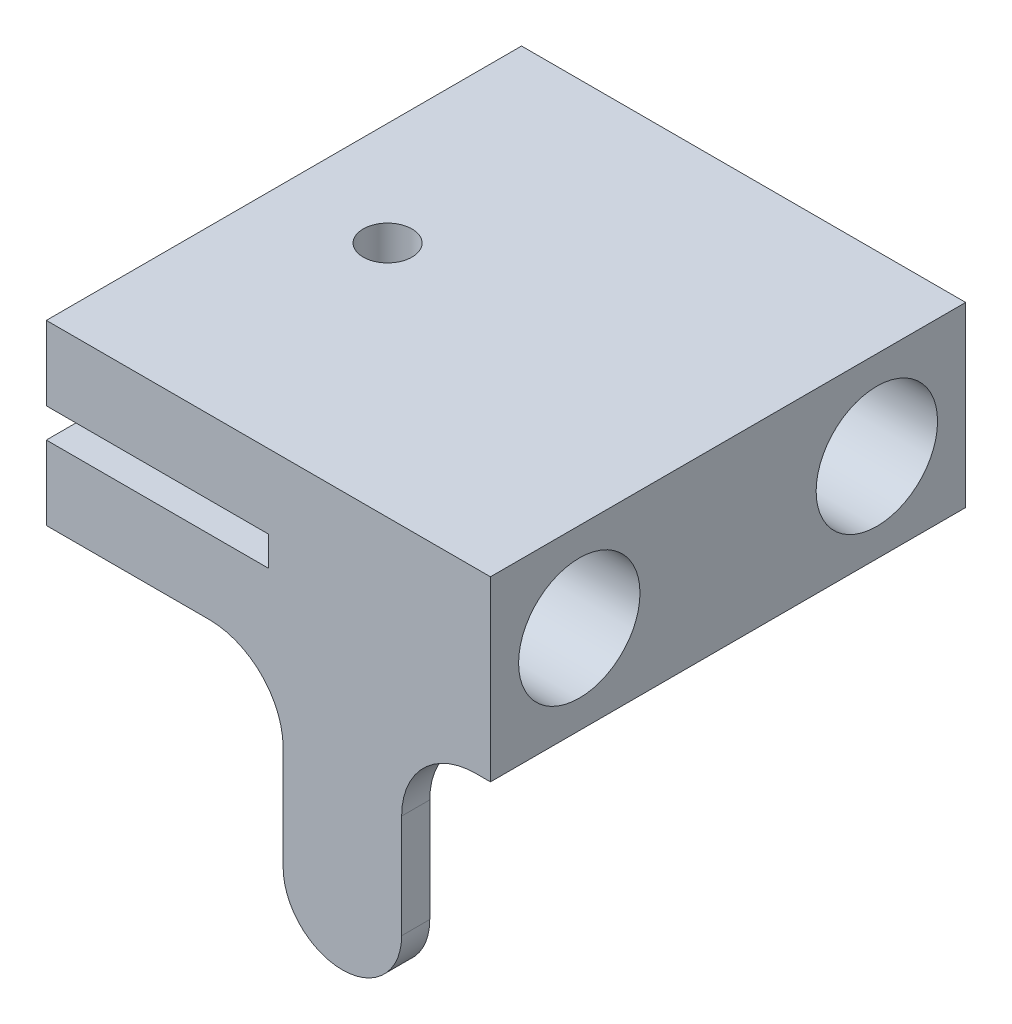
ISO-10303-21;
HEADER;
FILE_DESCRIPTION(('STEP AP214'),'2;1');
FILE_NAME('part.step','',(''),(''),'','','');
FILE_SCHEMA(('AUTOMOTIVE_DESIGN { 1 0 10303 214 1 1 1 1 }'));
ENDSEC;
DATA;
#1=APPLICATION_CONTEXT('core data for automotive mechanical design processes');
#2=APPLICATION_PROTOCOL_DEFINITION('international standard','automotive_design',2000,#1);
#3=PRODUCT_CONTEXT('',#1,'mechanical');
#4=PRODUCT('Part','Part','',(#3));
#5=PRODUCT_RELATED_PRODUCT_CATEGORY('part','',(#4));
#6=PRODUCT_DEFINITION_FORMATION('','',#4);
#7=PRODUCT_DEFINITION_CONTEXT('part definition',#1,'design');
#8=PRODUCT_DEFINITION('design','',#6,#7);
#9=PRODUCT_DEFINITION_SHAPE('','',#8);
#10=(LENGTH_UNIT() NAMED_UNIT(*) SI_UNIT(.MILLI.,.METRE.));
#11=(NAMED_UNIT(*) PLANE_ANGLE_UNIT() SI_UNIT($,.RADIAN.));
#12=(NAMED_UNIT(*) SI_UNIT($,.STERADIAN.) SOLID_ANGLE_UNIT());
#13=UNCERTAINTY_MEASURE_WITH_UNIT(LENGTH_MEASURE(1.E-05),#10,'distance_accuracy_value','');
#14=(GEOMETRIC_REPRESENTATION_CONTEXT(3) GLOBAL_UNCERTAINTY_ASSIGNED_CONTEXT((#13)) GLOBAL_UNIT_ASSIGNED_CONTEXT((#10,
#11,#12)) REPRESENTATION_CONTEXT('',''));
#15=CARTESIAN_POINT('',(0.,0.,0.));
#16=DIRECTION('',(0.,0.,1.));
#17=DIRECTION('',(1.,0.,0.));
#18=AXIS2_PLACEMENT_3D('',#15,#16,#17);
#19=CARTESIAN_POINT('',(19.9977441787769,-17.9977441787769,14.15));
#20=DIRECTION('',(0.,0.,-1.));
#21=DIRECTION('',(-1.,0.,0.));
#22=AXIS2_PLACEMENT_3D('',#19,#20,#21);
#23=CYLINDRICAL_SURFACE('',#22,4.00225582122314);
#24=DIRECTION('',(0.,0.,1.));
#25=VECTOR('',#24,1.);
#26=CARTESIAN_POINT('',(15.9954883575537,-17.9977441787769,14.15));
#27=LINE('',#26,#25);
#28=CARTESIAN_POINT('',(15.9954883575537,-17.9977441787769,14.15));
#29=VERTEX_POINT('',#28);
#30=CARTESIAN_POINT('',(15.9954883575537,-17.9977441787769,16.05));
#31=VERTEX_POINT('',#30);
#32=EDGE_CURVE('E391',#29,#31,#27,.T.);
#33=ORIENTED_EDGE('',*,*,#32,.F.);
#34=CARTESIAN_POINT('',(19.9977441787769,-17.9977441787769,14.15));
#35=DIRECTION('',(0.,0.,1.));
#36=DIRECTION('',(1.,0.,0.));
#37=AXIS2_PLACEMENT_3D('',#34,#35,#36);
#38=CIRCLE('',#37,4.00225582122314);
#39=CARTESIAN_POINT('',(24.,-17.9977441787769,14.15));
#40=VERTEX_POINT('',#39);
#41=EDGE_CURVE('E52',#40,#29,#38,.F.);
#42=ORIENTED_EDGE('',*,*,#41,.F.);
#43=DIRECTION('',(0.,0.,1.));
#44=VECTOR('',#43,1.);
#45=CARTESIAN_POINT('',(24.,-17.9977441787769,14.15));
#46=LINE('',#45,#44);
#47=CARTESIAN_POINT('',(24.,-17.9977441787769,16.05));
#48=VERTEX_POINT('',#47);
#49=EDGE_CURVE('E395',#48,#40,#46,.F.);
#50=ORIENTED_EDGE('',*,*,#49,.F.);
#51=CARTESIAN_POINT('',(19.9977441787769,-17.9977441787769,16.05));
#52=DIRECTION('',(0.,0.,1.));
#53=DIRECTION('',(1.,0.,0.));
#54=AXIS2_PLACEMENT_3D('',#51,#52,#53);
#55=CIRCLE('',#54,4.00225582122314);
#56=EDGE_CURVE('E11',#31,#48,#55,.T.);
#57=ORIENTED_EDGE('',*,*,#56,.F.);
#58=EDGE_LOOP('',(#33,#42,#50,#57));
#59=FACE_BOUND('',#58,.T.);
#60=ADVANCED_FACE('F43',(#59),#23,.T.);
#61=CARTESIAN_POINT('',(29.,-11.,0.));
#62=DIRECTION('',(0.,0.,1.));
#63=DIRECTION('',(1.,0.,0.));
#64=AXIS2_PLACEMENT_3D('',#61,#62,#63);
#65=CYLINDRICAL_SURFACE('',#64,5.);
#66=DIRECTION('',(0.,0.,-1.));
#67=VECTOR('',#66,1.);
#68=CARTESIAN_POINT('',(29.,-6.,0.));
#69=LINE('',#68,#67);
#70=CARTESIAN_POINT('',(29.,-6.,16.05));
#71=VERTEX_POINT('',#70);
#72=CARTESIAN_POINT('',(29.,-6.,14.15));
#73=VERTEX_POINT('',#72);
#74=EDGE_CURVE('E375',#71,#73,#69,.T.);
#75=ORIENTED_EDGE('',*,*,#74,.F.);
#76=CARTESIAN_POINT('',(29.,-11.,16.05));
#77=DIRECTION('',(0.,0.,1.));
#78=DIRECTION('',(1.,0.,0.));
#79=AXIS2_PLACEMENT_3D('',#76,#77,#78);
#80=CIRCLE('',#79,5.);
#81=CARTESIAN_POINT('',(24.,-11.,16.05));
#82=VERTEX_POINT('',#81);
#83=EDGE_CURVE('E383',#71,#82,#80,.T.);
#84=ORIENTED_EDGE('',*,*,#83,.T.);
#85=DIRECTION('',(0.,0.,-1.));
#86=VECTOR('',#85,1.);
#87=CARTESIAN_POINT('',(24.,-11.,0.));
#88=LINE('',#87,#86);
#89=CARTESIAN_POINT('',(24.,-11.,14.15));
#90=VERTEX_POINT('',#89);
#91=EDGE_CURVE('E379',#90,#82,#88,.F.);
#92=ORIENTED_EDGE('',*,*,#91,.F.);
#93=CARTESIAN_POINT('',(29.,-11.,14.15));
#94=DIRECTION('',(0.,0.,1.));
#95=DIRECTION('',(1.,0.,0.));
#96=AXIS2_PLACEMENT_3D('',#93,#94,#95);
#97=CIRCLE('',#96,5.);
#98=EDGE_CURVE('E387',#90,#73,#97,.F.);
#99=ORIENTED_EDGE('',*,*,#98,.T.);
#100=EDGE_LOOP('',(#75,#84,#92,#99));
#101=FACE_BOUND('',#100,.T.);
#102=ADVANCED_FACE('F525',(#101),#65,.F.);
#103=CARTESIAN_POINT('',(10.9954883575537,-11.,16.05));
#104=DIRECTION('',(0.,0.,1.));
#105=DIRECTION('',(1.,0.,0.));
#106=AXIS2_PLACEMENT_3D('',#103,#104,#105);
#107=CYLINDRICAL_SURFACE('',#106,5.);
#108=DIRECTION('',(0.,0.,-1.));
#109=VECTOR('',#108,1.);
#110=CARTESIAN_POINT('',(15.9954883575537,-11.,16.05));
#111=LINE('',#110,#109);
#112=CARTESIAN_POINT('',(15.9954883575537,-11.,16.05));
#113=VERTEX_POINT('',#112);
#114=CARTESIAN_POINT('',(15.9954883575537,-11.,14.15));
#115=VERTEX_POINT('',#114);
#116=EDGE_CURVE('E360',#113,#115,#111,.T.);
#117=ORIENTED_EDGE('',*,*,#116,.F.);
#118=CARTESIAN_POINT('',(10.9954883575537,-11.,16.05));
#119=DIRECTION('',(0.,0.,1.));
#120=DIRECTION('',(1.,0.,0.));
#121=AXIS2_PLACEMENT_3D('',#118,#119,#120);
#122=CIRCLE('',#121,5.);
#123=CARTESIAN_POINT('',(10.9954883575537,-6.,16.05));
#124=VERTEX_POINT('',#123);
#125=EDGE_CURVE('E368',#113,#124,#122,.T.);
#126=ORIENTED_EDGE('',*,*,#125,.T.);
#127=DIRECTION('',(0.,0.,-1.));
#128=VECTOR('',#127,1.);
#129=CARTESIAN_POINT('',(10.9954883575537,-6.,16.05));
#130=LINE('',#129,#128);
#131=CARTESIAN_POINT('',(10.9954883575537,-6.,14.15));
#132=VERTEX_POINT('',#131);
#133=EDGE_CURVE('E364',#132,#124,#130,.F.);
#134=ORIENTED_EDGE('',*,*,#133,.F.);
#135=CARTESIAN_POINT('',(10.9954883575537,-11.,14.15));
#136=DIRECTION('',(0.,0.,1.));
#137=DIRECTION('',(1.,0.,0.));
#138=AXIS2_PLACEMENT_3D('',#135,#136,#137);
#139=CIRCLE('',#138,5.);
#140=EDGE_CURVE('E371',#132,#115,#139,.F.);
#141=ORIENTED_EDGE('',*,*,#140,.T.);
#142=EDGE_LOOP('',(#117,#126,#134,#141));
#143=FACE_BOUND('',#142,.T.);
#144=ADVANCED_FACE('F529',(#143),#107,.F.);
#145=CARTESIAN_POINT('',(30.,-6.,0.));
#146=DIRECTION('',(0.,1.,0.));
#147=DIRECTION('',(0.,0.,1.));
#148=AXIS2_PLACEMENT_3D('',#145,#146,#147);
#149=PLANE('',#148);
#150=CARTESIAN_POINT('',(7.,-6.,0.));
#151=DIRECTION('',(0.,-1.,0.));
#152=DIRECTION('',(0.,0.,-1.));
#153=AXIS2_PLACEMENT_3D('',#150,#151,#152);
#154=CIRCLE('',#153,3.1);
#155=CARTESIAN_POINT('',(7.,-6.,-3.1));
#156=VERTEX_POINT('',#155);
#157=EDGE_CURVE('E423',#156,#156,#154,.T.);
#158=ORIENTED_EDGE('',*,*,#157,.F.);
#159=EDGE_LOOP('',(#158));
#160=FACE_BOUND('',#159,.T.);
#161=DIRECTION('',(-1.,0.,0.));
#162=VECTOR('',#161,1.);
#163=CARTESIAN_POINT('',(30.,-6.,16.05));
#164=LINE('',#163,#162);
#165=CARTESIAN_POINT('',(30.,-6.,16.05));
#166=VERTEX_POINT('',#165);
#167=EDGE_CURVE('E325',#166,#71,#164,.T.);
#168=ORIENTED_EDGE('',*,*,#167,.T.);
#169=ORIENTED_EDGE('',*,*,#74,.T.);
#170=DIRECTION('',(1.,0.,0.));
#171=VECTOR('',#170,1.);
#172=CARTESIAN_POINT('',(20.,-6.,14.15));
#173=LINE('',#172,#171);
#174=EDGE_CURVE('E411',#132,#73,#173,.T.);
#175=ORIENTED_EDGE('',*,*,#174,.F.);
#176=ORIENTED_EDGE('',*,*,#133,.T.);
#177=CARTESIAN_POINT('',(0.,-6.,16.05));
#178=VERTEX_POINT('',#177);
#179=EDGE_CURVE('E299',#124,#178,#164,.T.);
#180=ORIENTED_EDGE('',*,*,#179,.T.);
#181=DIRECTION('',(0.,0.,-1.));
#182=VECTOR('',#181,1.);
#183=CARTESIAN_POINT('',(0.,-6.,0.));
#184=LINE('',#183,#182);
#185=CARTESIAN_POINT('',(0.,-6.,-16.05));
#186=VERTEX_POINT('',#185);
#187=EDGE_CURVE('E309',#178,#186,#184,.T.);
#188=ORIENTED_EDGE('',*,*,#187,.T.);
#189=DIRECTION('',(-1.,0.,0.));
#190=VECTOR('',#189,1.);
#191=CARTESIAN_POINT('',(30.,-6.,-16.05));
#192=LINE('',#191,#190);
#193=CARTESIAN_POINT('',(30.,-6.,-16.05));
#194=VERTEX_POINT('',#193);
#195=EDGE_CURVE('E336',#194,#186,#192,.T.);
#196=ORIENTED_EDGE('',*,*,#195,.F.);
#197=DIRECTION('',(0.,0.,-1.));
#198=VECTOR('',#197,1.);
#199=CARTESIAN_POINT('',(30.,-6.,0.));
#200=LINE('',#199,#198);
#201=EDGE_CURVE('E284',#166,#194,#200,.T.);
#202=ORIENTED_EDGE('',*,*,#201,.F.);
#203=EDGE_LOOP('',(#168,#169,#175,#176,#180,#188,#196,#202));
#204=FACE_BOUND('',#203,.T.);
#205=ADVANCED_FACE('F508',(#160,#204),#149,.F.);
#206=CARTESIAN_POINT('',(7.,-5.99999999999999,0.));
#207=DIRECTION('',(0.,1.,0.));
#208=DIRECTION('',(0.,0.,1.));
#209=AXIS2_PLACEMENT_3D('',#206,#207,#208);
#210=CYLINDRICAL_SURFACE('',#209,1.65);
#211=CARTESIAN_POINT('',(7.,-1.,0.));
#212=DIRECTION('',(0.,1.,0.));
#213=DIRECTION('',(0.,0.,1.));
#214=AXIS2_PLACEMENT_3D('',#211,#212,#213);
#215=CIRCLE('',#214,1.65);
#216=CARTESIAN_POINT('',(7.,-1.,1.65));
#217=VERTEX_POINT('',#216);
#218=EDGE_CURVE('E212',#217,#217,#215,.T.);
#219=ORIENTED_EDGE('',*,*,#218,.T.);
#220=EDGE_LOOP('',(#219));
#221=FACE_BOUND('',#220,.T.);
#222=CARTESIAN_POINT('',(7.,-4.,0.));
#223=DIRECTION('',(0.,-1.,0.));
#224=DIRECTION('',(0.,0.,-1.));
#225=AXIS2_PLACEMENT_3D('',#222,#223,#224);
#226=CIRCLE('',#225,1.65);
#227=CARTESIAN_POINT('',(7.,-4.,-1.65));
#228=VERTEX_POINT('',#227);
#229=EDGE_CURVE('E355',#228,#228,#226,.F.);
#230=ORIENTED_EDGE('',*,*,#229,.F.);
#231=EDGE_LOOP('',(#230));
#232=FACE_BOUND('',#231,.T.);
#233=ADVANCED_FACE('F436',(#221,#232),#210,.F.);
#234=CARTESIAN_POINT('',(30.,0.,-16.05));
#235=DIRECTION('',(0.,0.,1.));
#236=DIRECTION('',(1.,0.,0.));
#237=AXIS2_PLACEMENT_3D('',#234,#235,#236);
#238=PLANE('',#237);
#239=DIRECTION('',(-1.,0.,0.));
#240=VECTOR('',#239,1.);
#241=CARTESIAN_POINT('',(30.,-1.,-16.05));
#242=LINE('',#241,#240);
#243=CARTESIAN_POINT('',(15.,-1.,-16.05));
#244=VERTEX_POINT('',#243);
#245=CARTESIAN_POINT('',(0.,-1.,-16.05));
#246=VERTEX_POINT('',#245);
#247=EDGE_CURVE('E259',#244,#246,#242,.T.);
#248=ORIENTED_EDGE('',*,*,#247,.F.);
#249=DIRECTION('',(0.,-1.,0.));
#250=VECTOR('',#249,1.);
#251=CARTESIAN_POINT('',(15.,0.,-16.05));
#252=LINE('',#251,#250);
#253=CARTESIAN_POINT('',(15.,1.,-16.05));
#254=VERTEX_POINT('',#253);
#255=EDGE_CURVE('E271',#254,#244,#252,.T.);
#256=ORIENTED_EDGE('',*,*,#255,.F.);
#257=DIRECTION('',(-1.,0.,0.));
#258=VECTOR('',#257,1.);
#259=CARTESIAN_POINT('',(30.,1.,-16.05));
#260=LINE('',#259,#258);
#261=CARTESIAN_POINT('',(0.,1.,-16.05));
#262=VERTEX_POINT('',#261);
#263=EDGE_CURVE('E239',#254,#262,#260,.T.);
#264=ORIENTED_EDGE('',*,*,#263,.T.);
#265=DIRECTION('',(0.,1.,0.));
#266=VECTOR('',#265,1.);
#267=CARTESIAN_POINT('',(0.,0.,-16.05));
#268=LINE('',#267,#266);
#269=CARTESIAN_POINT('',(0.,6.,-16.05));
#270=VERTEX_POINT('',#269);
#271=EDGE_CURVE('E313',#262,#270,#268,.T.);
#272=ORIENTED_EDGE('',*,*,#271,.T.);
#273=DIRECTION('',(-1.,0.,0.));
#274=VECTOR('',#273,1.);
#275=CARTESIAN_POINT('',(30.,6.,-16.05));
#276=LINE('',#275,#274);
#277=CARTESIAN_POINT('',(30.,6.,-16.05));
#278=VERTEX_POINT('',#277);
#279=EDGE_CURVE('E332',#278,#270,#276,.T.);
#280=ORIENTED_EDGE('',*,*,#279,.F.);
#281=DIRECTION('',(0.,1.,0.));
#282=VECTOR('',#281,1.);
#283=CARTESIAN_POINT('',(30.,0.,-16.05));
#284=LINE('',#283,#282);
#285=EDGE_CURVE('E288',#194,#278,#284,.T.);
#286=ORIENTED_EDGE('',*,*,#285,.F.);
#287=ORIENTED_EDGE('',*,*,#195,.T.);
#288=EDGE_CURVE('E314',#186,#246,#268,.T.);
#289=ORIENTED_EDGE('',*,*,#288,.T.);
#290=EDGE_LOOP('',(#248,#256,#264,#272,#280,#286,#287,#289));
#291=FACE_BOUND('',#290,.T.);
#292=ADVANCED_FACE('F494',(#291),#238,.F.);
#293=CARTESIAN_POINT('',(30.,0.,10.05));
#294=DIRECTION('',(-1.,0.,0.));
#295=DIRECTION('',(0.,0.,1.));
#296=AXIS2_PLACEMENT_3D('',#293,#294,#295);
#297=CYLINDRICAL_SURFACE('',#296,4.1);
#298=CARTESIAN_POINT('',(30.,0.,10.05));
#299=DIRECTION('',(1.,0.,0.));
#300=DIRECTION('',(0.,0.,-1.));
#301=AXIS2_PLACEMENT_3D('',#298,#299,#300);
#302=CIRCLE('',#301,4.1);
#303=CARTESIAN_POINT('',(30.,0.,5.95));
#304=VERTEX_POINT('',#303);
#305=EDGE_CURVE('E279',#304,#304,#302,.T.);
#306=ORIENTED_EDGE('',*,*,#305,.T.);
#307=EDGE_LOOP('',(#306));
#308=FACE_BOUND('',#307,.T.);
#309=CARTESIAN_POINT('',(15.,0.,10.05));
#310=DIRECTION('',(-1.,0.,0.));
#311=DIRECTION('',(0.,0.,1.));
#312=AXIS2_PLACEMENT_3D('',#309,#310,#311);
#313=CIRCLE('',#312,4.1);
#314=CARTESIAN_POINT('',(15.,1.,6.07382092958579));
#315=VERTEX_POINT('',#314);
#316=CARTESIAN_POINT('',(15.,-1.,6.07382092958579));
#317=VERTEX_POINT('',#316);
#318=EDGE_CURVE('E270',#315,#317,#313,.T.);
#319=ORIENTED_EDGE('',*,*,#318,.T.);
#320=DIRECTION('',(-1.,0.,0.));
#321=VECTOR('',#320,1.);
#322=CARTESIAN_POINT('',(30.,-1.,6.07382092958579));
#323=LINE('',#322,#321);
#324=CARTESIAN_POINT('',(0.,-1.,6.07382092958579));
#325=VERTEX_POINT('',#324);
#326=EDGE_CURVE('E255',#317,#325,#323,.T.);
#327=ORIENTED_EDGE('',*,*,#326,.T.);
#328=CARTESIAN_POINT('',(0.,0.,10.05));
#329=DIRECTION('',(1.,0.,0.));
#330=DIRECTION('',(0.,0.,-1.));
#331=AXIS2_PLACEMENT_3D('',#328,#329,#330);
#332=CIRCLE('',#331,4.1);
#333=CARTESIAN_POINT('',(0.,-1.,14.0261790704142));
#334=VERTEX_POINT('',#333);
#335=EDGE_CURVE('E304',#334,#325,#332,.T.);
#336=ORIENTED_EDGE('',*,*,#335,.F.);
#337=DIRECTION('',(-1.,0.,0.));
#338=VECTOR('',#337,1.);
#339=CARTESIAN_POINT('',(30.,-1.,14.0261790704142));
#340=LINE('',#339,#338);
#341=CARTESIAN_POINT('',(15.,-1.,14.0261790704142));
#342=VERTEX_POINT('',#341);
#343=EDGE_CURVE('E251',#334,#342,#340,.F.);
#344=ORIENTED_EDGE('',*,*,#343,.T.);
#345=CARTESIAN_POINT('',(15.,1.,14.0261790704142));
#346=VERTEX_POINT('',#345);
#347=EDGE_CURVE('E267',#342,#346,#313,.T.);
#348=ORIENTED_EDGE('',*,*,#347,.T.);
#349=DIRECTION('',(-1.,0.,0.));
#350=VECTOR('',#349,1.);
#351=CARTESIAN_POINT('',(30.,1.,14.0261790704142));
#352=LINE('',#351,#350);
#353=CARTESIAN_POINT('',(0.,1.,14.0261790704142));
#354=VERTEX_POINT('',#353);
#355=EDGE_CURVE('E196',#354,#346,#352,.F.);
#356=ORIENTED_EDGE('',*,*,#355,.F.);
#357=CARTESIAN_POINT('',(0.,1.,6.07382092958579));
#358=VERTEX_POINT('',#357);
#359=EDGE_CURVE('E305',#358,#354,#332,.T.);
#360=ORIENTED_EDGE('',*,*,#359,.F.);
#361=DIRECTION('',(-1.,0.,0.));
#362=VECTOR('',#361,1.);
#363=CARTESIAN_POINT('',(30.,1.,6.07382092958579));
#364=LINE('',#363,#362);
#365=EDGE_CURVE('E236',#315,#358,#364,.T.);
#366=ORIENTED_EDGE('',*,*,#365,.F.);
#367=EDGE_LOOP('',(#319,#327,#336,#344,#348,#356,#360,#366));
#368=FACE_BOUND('',#367,.T.);
#369=ADVANCED_FACE('F476',(#308,#368),#297,.F.);
#370=CARTESIAN_POINT('',(30.,0.,-10.05));
#371=DIRECTION('',(-1.,0.,0.));
#372=DIRECTION('',(0.,0.,1.));
#373=AXIS2_PLACEMENT_3D('',#370,#371,#372);
#374=CYLINDRICAL_SURFACE('',#373,4.1);
#375=CARTESIAN_POINT('',(30.,0.,-10.05));
#376=DIRECTION('',(1.,0.,0.));
#377=DIRECTION('',(0.,0.,-1.));
#378=AXIS2_PLACEMENT_3D('',#375,#376,#377);
#379=CIRCLE('',#378,4.1);
#380=CARTESIAN_POINT('',(30.,0.,-14.15));
#381=VERTEX_POINT('',#380);
#382=EDGE_CURVE('E275',#381,#381,#379,.T.);
#383=ORIENTED_EDGE('',*,*,#382,.T.);
#384=EDGE_LOOP('',(#383));
#385=FACE_BOUND('',#384,.T.);
#386=CARTESIAN_POINT('',(15.,0.,-10.05));
#387=DIRECTION('',(-1.,0.,0.));
#388=DIRECTION('',(0.,0.,1.));
#389=AXIS2_PLACEMENT_3D('',#386,#387,#388);
#390=CIRCLE('',#389,4.1);
#391=CARTESIAN_POINT('',(15.,1.,-14.0261790704142));
#392=VERTEX_POINT('',#391);
#393=CARTESIAN_POINT('',(15.,-1.,-14.0261790704142));
#394=VERTEX_POINT('',#393);
#395=EDGE_CURVE('E266',#392,#394,#390,.T.);
#396=ORIENTED_EDGE('',*,*,#395,.T.);
#397=DIRECTION('',(-1.,0.,0.));
#398=VECTOR('',#397,1.);
#399=CARTESIAN_POINT('',(30.,-1.,-14.0261790704142));
#400=LINE('',#399,#398);
#401=CARTESIAN_POINT('',(0.,-1.,-14.0261790704142));
#402=VERTEX_POINT('',#401);
#403=EDGE_CURVE('E247',#394,#402,#400,.T.);
#404=ORIENTED_EDGE('',*,*,#403,.T.);
#405=CARTESIAN_POINT('',(0.,0.,-10.05));
#406=DIRECTION('',(1.,0.,0.));
#407=DIRECTION('',(0.,0.,-1.));
#408=AXIS2_PLACEMENT_3D('',#405,#406,#407);
#409=CIRCLE('',#408,4.1);
#410=CARTESIAN_POINT('',(0.,-1.,-6.07382092958579));
#411=VERTEX_POINT('',#410);
#412=EDGE_CURVE('E274',#411,#402,#409,.T.);
#413=ORIENTED_EDGE('',*,*,#412,.F.);
#414=DIRECTION('',(-1.,0.,0.));
#415=VECTOR('',#414,1.);
#416=CARTESIAN_POINT('',(30.,-1.,-6.07382092958579));
#417=LINE('',#416,#415);
#418=CARTESIAN_POINT('',(15.,-1.,-6.07382092958579));
#419=VERTEX_POINT('',#418);
#420=EDGE_CURVE('E243',#411,#419,#417,.F.);
#421=ORIENTED_EDGE('',*,*,#420,.T.);
#422=CARTESIAN_POINT('',(15.,1.,-6.07382092958579));
#423=VERTEX_POINT('',#422);
#424=EDGE_CURVE('E262',#419,#423,#390,.T.);
#425=ORIENTED_EDGE('',*,*,#424,.T.);
#426=DIRECTION('',(-1.,0.,0.));
#427=VECTOR('',#426,1.);
#428=CARTESIAN_POINT('',(30.,1.,-6.07382092958579));
#429=LINE('',#428,#427);
#430=CARTESIAN_POINT('',(0.,1.,-6.07382092958579));
#431=VERTEX_POINT('',#430);
#432=EDGE_CURVE('E228',#431,#423,#429,.F.);
#433=ORIENTED_EDGE('',*,*,#432,.F.);
#434=CARTESIAN_POINT('',(0.,1.,-14.0261790704142));
#435=VERTEX_POINT('',#434);
#436=EDGE_CURVE('E300',#435,#431,#409,.T.);
#437=ORIENTED_EDGE('',*,*,#436,.F.);
#438=DIRECTION('',(-1.,0.,0.));
#439=VECTOR('',#438,1.);
#440=CARTESIAN_POINT('',(30.,1.,-14.0261790704142));
#441=LINE('',#440,#439);
#442=EDGE_CURVE('E231',#392,#435,#441,.T.);
#443=ORIENTED_EDGE('',*,*,#442,.F.);
#444=EDGE_LOOP('',(#396,#404,#413,#421,#425,#433,#437,#443));
#445=FACE_BOUND('',#444,.T.);
#446=ADVANCED_FACE('F455',(#385,#445),#374,.F.);
#447=CARTESIAN_POINT('',(30.,0.,16.05));
#448=DIRECTION('',(0.,0.,1.));
#449=DIRECTION('',(1.,0.,0.));
#450=AXIS2_PLACEMENT_3D('',#447,#448,#449);
#451=PLANE('',#450);
#452=DIRECTION('',(0.,1.,0.));
#453=VECTOR('',#452,1.);
#454=CARTESIAN_POINT('',(15.9954883575537,-22.,16.05));
#455=LINE('',#454,#453);
#456=EDGE_CURVE('E410',#31,#113,#455,.T.);
#457=ORIENTED_EDGE('',*,*,#456,.F.);
#458=ORIENTED_EDGE('',*,*,#56,.T.);
#459=DIRECTION('',(0.,1.,0.));
#460=VECTOR('',#459,1.);
#461=CARTESIAN_POINT('',(24.,-22.,16.05));
#462=LINE('',#461,#460);
#463=EDGE_CURVE('E415',#48,#82,#462,.T.);
#464=ORIENTED_EDGE('',*,*,#463,.T.);
#465=ORIENTED_EDGE('',*,*,#83,.F.);
#466=ORIENTED_EDGE('',*,*,#167,.F.);
#467=DIRECTION('',(0.,1.,0.));
#468=VECTOR('',#467,1.);
#469=CARTESIAN_POINT('',(30.,0.,16.05));
#470=LINE('',#469,#468);
#471=CARTESIAN_POINT('',(30.,6.,16.05));
#472=VERTEX_POINT('',#471);
#473=EDGE_CURVE('E295',#166,#472,#470,.T.);
#474=ORIENTED_EDGE('',*,*,#473,.T.);
#475=DIRECTION('',(-1.,0.,0.));
#476=VECTOR('',#475,1.);
#477=CARTESIAN_POINT('',(30.,6.,16.05));
#478=LINE('',#477,#476);
#479=CARTESIAN_POINT('',(0.,6.,16.05));
#480=VERTEX_POINT('',#479);
#481=EDGE_CURVE('E329',#472,#480,#478,.T.);
#482=ORIENTED_EDGE('',*,*,#481,.T.);
#483=DIRECTION('',(0.,1.,0.));
#484=VECTOR('',#483,1.);
#485=CARTESIAN_POINT('',(0.,0.,16.05));
#486=LINE('',#485,#484);
#487=CARTESIAN_POINT('',(0.,1.,16.05));
#488=VERTEX_POINT('',#487);
#489=EDGE_CURVE('E217',#488,#480,#486,.T.);
#490=ORIENTED_EDGE('',*,*,#489,.F.);
#491=DIRECTION('',(-1.,0.,0.));
#492=VECTOR('',#491,1.);
#493=CARTESIAN_POINT('',(0.,1.,16.05));
#494=LINE('',#493,#492);
#495=CARTESIAN_POINT('',(15.,1.,16.05));
#496=VERTEX_POINT('',#495);
#497=EDGE_CURVE('E193',#496,#488,#494,.T.);
#498=ORIENTED_EDGE('',*,*,#497,.F.);
#499=DIRECTION('',(0.,-1.,0.));
#500=VECTOR('',#499,1.);
#501=CARTESIAN_POINT('',(15.,0.,16.05));
#502=LINE('',#501,#500);
#503=CARTESIAN_POINT('',(15.,-1.,16.05));
#504=VERTEX_POINT('',#503);
#505=EDGE_CURVE('E205',#496,#504,#502,.T.);
#506=ORIENTED_EDGE('',*,*,#505,.T.);
#507=DIRECTION('',(-1.,0.,0.));
#508=VECTOR('',#507,1.);
#509=CARTESIAN_POINT('',(0.,-1.,16.05));
#510=LINE('',#509,#508);
#511=CARTESIAN_POINT('',(0.,-1.,16.05));
#512=VERTEX_POINT('',#511);
#513=EDGE_CURVE('E201',#504,#512,#510,.T.);
#514=ORIENTED_EDGE('',*,*,#513,.T.);
#515=EDGE_CURVE('E280',#178,#512,#486,.T.);
#516=ORIENTED_EDGE('',*,*,#515,.F.);
#517=ORIENTED_EDGE('',*,*,#179,.F.);
#518=ORIENTED_EDGE('',*,*,#125,.F.);
#519=EDGE_LOOP('',(#457,#458,#464,#465,#466,#474,#482,#490,#498,#506,#514,#516,#517,#518));
#520=FACE_BOUND('',#519,.T.);
#521=ADVANCED_FACE('F215',(#520),#451,.T.);
#522=CARTESIAN_POINT('',(0.,0.,0.));
#523=DIRECTION('',(1.,0.,0.));
#524=DIRECTION('',(0.,0.,-1.));
#525=AXIS2_PLACEMENT_3D('',#522,#523,#524);
#526=PLANE('',#525);
#527=DIRECTION('',(0.,0.,1.));
#528=VECTOR('',#527,1.);
#529=CARTESIAN_POINT('',(0.,-1.,0.));
#530=LINE('',#529,#528);
#531=EDGE_CURVE('E349',#246,#402,#530,.T.);
#532=ORIENTED_EDGE('',*,*,#531,.F.);
#533=ORIENTED_EDGE('',*,*,#288,.F.);
#534=ORIENTED_EDGE('',*,*,#187,.F.);
#535=ORIENTED_EDGE('',*,*,#515,.T.);
#536=EDGE_CURVE('E345',#334,#512,#530,.T.);
#537=ORIENTED_EDGE('',*,*,#536,.F.);
#538=ORIENTED_EDGE('',*,*,#335,.T.);
#539=EDGE_CURVE('E348',#411,#325,#530,.T.);
#540=ORIENTED_EDGE('',*,*,#539,.F.);
#541=ORIENTED_EDGE('',*,*,#412,.T.);
#542=EDGE_LOOP('',(#532,#533,#534,#535,#537,#538,#540,#541));
#543=FACE_BOUND('',#542,.T.);
#544=ADVANCED_FACE('F496',(#543),#526,.F.);
#545=CARTESIAN_POINT('',(30.,6.,0.));
#546=DIRECTION('',(0.,1.,0.));
#547=DIRECTION('',(0.,0.,1.));
#548=AXIS2_PLACEMENT_3D('',#545,#546,#547);
#549=PLANE('',#548);
#550=CARTESIAN_POINT('',(7.,6.,0.));
#551=DIRECTION('',(0.,1.,0.));
#552=DIRECTION('',(0.,0.,1.));
#553=AXIS2_PLACEMENT_3D('',#550,#551,#552);
#554=CIRCLE('',#553,1.65);
#555=CARTESIAN_POINT('',(7.,6.,1.65));
#556=VERTEX_POINT('',#555);
#557=EDGE_CURVE('E354',#556,#556,#554,.T.);
#558=ORIENTED_EDGE('',*,*,#557,.F.);
#559=EDGE_LOOP('',(#558));
#560=FACE_BOUND('',#559,.T.);
#561=DIRECTION('',(0.,0.,-1.));
#562=VECTOR('',#561,1.);
#563=CARTESIAN_POINT('',(0.,6.,0.));
#564=LINE('',#563,#562);
#565=EDGE_CURVE('E318',#480,#270,#564,.T.);
#566=ORIENTED_EDGE('',*,*,#565,.F.);
#567=ORIENTED_EDGE('',*,*,#481,.F.);
#568=DIRECTION('',(0.,0.,-1.));
#569=VECTOR('',#568,1.);
#570=CARTESIAN_POINT('',(30.,6.,0.));
#571=LINE('',#570,#569);
#572=EDGE_CURVE('E291',#472,#278,#571,.T.);
#573=ORIENTED_EDGE('',*,*,#572,.T.);
#574=ORIENTED_EDGE('',*,*,#279,.T.);
#575=EDGE_LOOP('',(#566,#567,#573,#574));
#576=FACE_BOUND('',#575,.T.);
#577=ADVANCED_FACE('F549',(#560,#576),#549,.T.);
#578=CARTESIAN_POINT('',(30.,0.,0.));
#579=DIRECTION('',(1.,0.,0.));
#580=DIRECTION('',(0.,0.,-1.));
#581=AXIS2_PLACEMENT_3D('',#578,#579,#580);
#582=PLANE('',#581);
#583=ORIENTED_EDGE('',*,*,#382,.F.);
#584=EDGE_LOOP('',(#583));
#585=FACE_BOUND('',#584,.T.);
#586=ORIENTED_EDGE('',*,*,#305,.F.);
#587=EDGE_LOOP('',(#586));
#588=FACE_BOUND('',#587,.T.);
#589=ORIENTED_EDGE('',*,*,#201,.T.);
#590=ORIENTED_EDGE('',*,*,#285,.T.);
#591=ORIENTED_EDGE('',*,*,#572,.F.);
#592=ORIENTED_EDGE('',*,*,#473,.F.);
#593=EDGE_LOOP('',(#589,#590,#591,#592));
#594=FACE_BOUND('',#593,.T.);
#595=ADVANCED_FACE('F552',(#585,#588,#594),#582,.T.);
#596=ORIENTED_EDGE('',*,*,#271,.F.);
#597=DIRECTION('',(0.,0.,1.));
#598=VECTOR('',#597,1.);
#599=CARTESIAN_POINT('',(0.,1.,0.));
#600=LINE('',#599,#598);
#601=EDGE_CURVE('E344',#262,#435,#600,.T.);
#602=ORIENTED_EDGE('',*,*,#601,.T.);
#603=ORIENTED_EDGE('',*,*,#436,.T.);
#604=EDGE_CURVE('E343',#431,#358,#600,.T.);
#605=ORIENTED_EDGE('',*,*,#604,.T.);
#606=ORIENTED_EDGE('',*,*,#359,.T.);
#607=EDGE_CURVE('E340',#354,#488,#600,.T.);
#608=ORIENTED_EDGE('',*,*,#607,.T.);
#609=ORIENTED_EDGE('',*,*,#489,.T.);
#610=ORIENTED_EDGE('',*,*,#565,.T.);
#611=EDGE_LOOP('',(#596,#602,#603,#605,#606,#608,#609,#610));
#612=FACE_BOUND('',#611,.T.);
#613=ADVANCED_FACE('F479',(#612),#526,.F.);
#614=CARTESIAN_POINT('',(0.,1.,-16.95));
#615=DIRECTION('',(0.,1.,0.));
#616=DIRECTION('',(0.,0.,1.));
#617=AXIS2_PLACEMENT_3D('',#614,#615,#616);
#618=PLANE('',#617);
#619=ORIENTED_EDGE('',*,*,#355,.T.);
#620=DIRECTION('',(0.,0.,1.));
#621=VECTOR('',#620,1.);
#622=CARTESIAN_POINT('',(15.,1.,-16.95));
#623=LINE('',#622,#621);
#624=EDGE_CURVE('E189',#346,#496,#623,.T.);
#625=ORIENTED_EDGE('',*,*,#624,.T.);
#626=ORIENTED_EDGE('',*,*,#497,.T.);
#627=ORIENTED_EDGE('',*,*,#607,.F.);
#628=EDGE_LOOP('',(#619,#625,#626,#627));
#629=FACE_BOUND('',#628,.T.);
#630=ADVANCED_FACE('F191',(#629),#618,.F.);
#631=CARTESIAN_POINT('',(0.,-1.,-16.95));
#632=DIRECTION('',(0.,1.,0.));
#633=DIRECTION('',(0.,0.,1.));
#634=AXIS2_PLACEMENT_3D('',#631,#632,#633);
#635=PLANE('',#634);
#636=ORIENTED_EDGE('',*,*,#536,.T.);
#637=ORIENTED_EDGE('',*,*,#513,.F.);
#638=DIRECTION('',(0.,0.,1.));
#639=VECTOR('',#638,1.);
#640=CARTESIAN_POINT('',(15.,-1.,-16.95));
#641=LINE('',#640,#639);
#642=EDGE_CURVE('E208',#342,#504,#641,.T.);
#643=ORIENTED_EDGE('',*,*,#642,.F.);
#644=ORIENTED_EDGE('',*,*,#343,.F.);
#645=EDGE_LOOP('',(#636,#637,#643,#644));
#646=FACE_BOUND('',#645,.T.);
#647=ADVANCED_FACE('F444',(#646),#635,.T.);
#648=CARTESIAN_POINT('',(15.,0.,-16.95));
#649=DIRECTION('',(-1.,0.,0.));
#650=DIRECTION('',(0.,0.,1.));
#651=AXIS2_PLACEMENT_3D('',#648,#649,#650);
#652=PLANE('',#651);
#653=ORIENTED_EDGE('',*,*,#642,.T.);
#654=ORIENTED_EDGE('',*,*,#505,.F.);
#655=ORIENTED_EDGE('',*,*,#624,.F.);
#656=ORIENTED_EDGE('',*,*,#347,.F.);
#657=EDGE_LOOP('',(#653,#654,#655,#656));
#658=FACE_BOUND('',#657,.T.);
#659=ADVANCED_FACE('F206',(#658),#652,.T.);
#660=ORIENTED_EDGE('',*,*,#218,.F.);
#661=EDGE_LOOP('',(#660));
#662=FACE_BOUND('',#661,.T.);
#663=EDGE_CURVE('E225',#419,#317,#641,.T.);
#664=ORIENTED_EDGE('',*,*,#663,.F.);
#665=ORIENTED_EDGE('',*,*,#420,.F.);
#666=ORIENTED_EDGE('',*,*,#539,.T.);
#667=ORIENTED_EDGE('',*,*,#326,.F.);
#668=EDGE_LOOP('',(#664,#665,#666,#667));
#669=FACE_BOUND('',#668,.T.);
#670=ADVANCED_FACE('F439',(#662,#669),#635,.T.);
#671=CARTESIAN_POINT('',(7.,1.,0.));
#672=DIRECTION('',(0.,1.,0.));
#673=DIRECTION('',(0.,0.,1.));
#674=AXIS2_PLACEMENT_3D('',#671,#672,#673);
#675=CIRCLE('',#674,1.65);
#676=CARTESIAN_POINT('',(7.,1.,1.65));
#677=VERTEX_POINT('',#676);
#678=EDGE_CURVE('E350',#677,#677,#675,.T.);
#679=ORIENTED_EDGE('',*,*,#678,.T.);
#680=EDGE_LOOP('',(#679));
#681=FACE_BOUND('',#680,.T.);
#682=ORIENTED_EDGE('',*,*,#365,.T.);
#683=ORIENTED_EDGE('',*,*,#604,.F.);
#684=ORIENTED_EDGE('',*,*,#432,.T.);
#685=EDGE_CURVE('E200',#423,#315,#623,.T.);
#686=ORIENTED_EDGE('',*,*,#685,.T.);
#687=EDGE_LOOP('',(#682,#683,#684,#686));
#688=FACE_BOUND('',#687,.T.);
#689=ADVANCED_FACE('F442',(#681,#688),#618,.F.);
#690=ORIENTED_EDGE('',*,*,#685,.F.);
#691=ORIENTED_EDGE('',*,*,#424,.F.);
#692=ORIENTED_EDGE('',*,*,#663,.T.);
#693=ORIENTED_EDGE('',*,*,#318,.F.);
#694=EDGE_LOOP('',(#690,#691,#692,#693));
#695=FACE_BOUND('',#694,.T.);
#696=ADVANCED_FACE('F520',(#695),#652,.T.);
#697=ORIENTED_EDGE('',*,*,#255,.T.);
#698=EDGE_CURVE('E226',#244,#394,#641,.T.);
#699=ORIENTED_EDGE('',*,*,#698,.T.);
#700=ORIENTED_EDGE('',*,*,#395,.F.);
#701=EDGE_CURVE('E203',#254,#392,#623,.T.);
#702=ORIENTED_EDGE('',*,*,#701,.F.);
#703=EDGE_LOOP('',(#697,#699,#700,#702));
#704=FACE_BOUND('',#703,.T.);
#705=ADVANCED_FACE('F490',(#704),#652,.T.);
#706=ORIENTED_EDGE('',*,*,#247,.T.);
#707=ORIENTED_EDGE('',*,*,#531,.T.);
#708=ORIENTED_EDGE('',*,*,#403,.F.);
#709=ORIENTED_EDGE('',*,*,#698,.F.);
#710=EDGE_LOOP('',(#706,#707,#708,#709));
#711=FACE_BOUND('',#710,.T.);
#712=ADVANCED_FACE('F445',(#711),#635,.T.);
#713=ORIENTED_EDGE('',*,*,#701,.T.);
#714=ORIENTED_EDGE('',*,*,#442,.T.);
#715=ORIENTED_EDGE('',*,*,#601,.F.);
#716=ORIENTED_EDGE('',*,*,#263,.F.);
#717=EDGE_LOOP('',(#713,#714,#715,#716));
#718=FACE_BOUND('',#717,.T.);
#719=ADVANCED_FACE('F486',(#718),#618,.F.);
#720=ORIENTED_EDGE('',*,*,#557,.T.);
#721=EDGE_LOOP('',(#720));
#722=FACE_BOUND('',#721,.T.);
#723=ORIENTED_EDGE('',*,*,#678,.F.);
#724=EDGE_LOOP('',(#723));
#725=FACE_BOUND('',#724,.T.);
#726=ADVANCED_FACE('F589',(#722,#725),#210,.F.);
#727=CARTESIAN_POINT('',(7.,-4.,0.));
#728=DIRECTION('',(0.,-1.,0.));
#729=DIRECTION('',(0.,0.,-1.));
#730=AXIS2_PLACEMENT_3D('',#727,#728,#729);
#731=PLANE('',#730);
#732=CARTESIAN_POINT('',(7.,-4.,0.));
#733=DIRECTION('',(0.,-1.,0.));
#734=DIRECTION('',(0.,0.,-1.));
#735=AXIS2_PLACEMENT_3D('',#732,#733,#734);
#736=CIRCLE('',#735,3.1);
#737=CARTESIAN_POINT('',(7.,-4.,-3.1));
#738=VERTEX_POINT('',#737);
#739=EDGE_CURVE('E359',#738,#738,#736,.T.);
#740=ORIENTED_EDGE('',*,*,#739,.T.);
#741=EDGE_LOOP('',(#740));
#742=FACE_BOUND('',#741,.T.);
#743=ORIENTED_EDGE('',*,*,#229,.T.);
#744=EDGE_LOOP('',(#743));
#745=FACE_BOUND('',#744,.T.);
#746=ADVANCED_FACE('F586',(#742,#745),#731,.T.);
#747=CARTESIAN_POINT('',(7.,-4.,0.));
#748=DIRECTION('',(0.,-1.,0.));
#749=DIRECTION('',(0.,0.,-1.));
#750=AXIS2_PLACEMENT_3D('',#747,#748,#749);
#751=CYLINDRICAL_SURFACE('',#750,3.1);
#752=ORIENTED_EDGE('',*,*,#739,.F.);
#753=EDGE_LOOP('',(#752));
#754=FACE_BOUND('',#753,.T.);
#755=ORIENTED_EDGE('',*,*,#157,.T.);
#756=EDGE_LOOP('',(#755));
#757=FACE_BOUND('',#756,.T.);
#758=ADVANCED_FACE('F583',(#754,#757),#751,.F.);
#759=CARTESIAN_POINT('',(20.,-22.,14.15));
#760=DIRECTION('',(0.,0.,1.));
#761=DIRECTION('',(1.,0.,0.));
#762=AXIS2_PLACEMENT_3D('',#759,#760,#761);
#763=PLANE('',#762);
#764=DIRECTION('',(0.,1.,0.));
#765=VECTOR('',#764,1.);
#766=CARTESIAN_POINT('',(24.,-22.,14.15));
#767=LINE('',#766,#765);
#768=EDGE_CURVE('E405',#40,#90,#767,.T.);
#769=ORIENTED_EDGE('',*,*,#768,.F.);
#770=ORIENTED_EDGE('',*,*,#41,.T.);
#771=DIRECTION('',(0.,1.,0.));
#772=VECTOR('',#771,1.);
#773=CARTESIAN_POINT('',(15.9954883575537,-22.,14.15));
#774=LINE('',#773,#772);
#775=EDGE_CURVE('E403',#29,#115,#774,.T.);
#776=ORIENTED_EDGE('',*,*,#775,.T.);
#777=ORIENTED_EDGE('',*,*,#140,.F.);
#778=ORIENTED_EDGE('',*,*,#174,.T.);
#779=ORIENTED_EDGE('',*,*,#98,.F.);
#780=EDGE_LOOP('',(#769,#770,#776,#777,#778,#779));
#781=FACE_BOUND('',#780,.T.);
#782=ADVANCED_FACE('F400',(#781),#763,.F.);
#783=CARTESIAN_POINT('',(24.,-22.,14.15));
#784=DIRECTION('',(-1.,0.,0.));
#785=DIRECTION('',(0.,0.,1.));
#786=AXIS2_PLACEMENT_3D('',#783,#784,#785);
#787=PLANE('',#786);
#788=ORIENTED_EDGE('',*,*,#463,.F.);
#789=ORIENTED_EDGE('',*,*,#49,.T.);
#790=ORIENTED_EDGE('',*,*,#768,.T.);
#791=ORIENTED_EDGE('',*,*,#91,.T.);
#792=EDGE_LOOP('',(#788,#789,#790,#791));
#793=FACE_BOUND('',#792,.T.);
#794=ADVANCED_FACE('F575',(#793),#787,.F.);
#795=CARTESIAN_POINT('',(15.9954883575537,-22.,16.05));
#796=DIRECTION('',(1.,0.,0.));
#797=DIRECTION('',(0.,0.,-1.));
#798=AXIS2_PLACEMENT_3D('',#795,#796,#797);
#799=PLANE('',#798);
#800=ORIENTED_EDGE('',*,*,#775,.F.);
#801=ORIENTED_EDGE('',*,*,#32,.T.);
#802=ORIENTED_EDGE('',*,*,#456,.T.);
#803=ORIENTED_EDGE('',*,*,#116,.T.);
#804=EDGE_LOOP('',(#800,#801,#802,#803));
#805=FACE_BOUND('',#804,.T.);
#806=ADVANCED_FACE('F407',(#805),#799,.F.);
#807=CLOSED_SHELL('',(#60,#102,#144,#205,#233,#292,#369,#446,#521,#544,#577,#595,#613,#630,#647,
#659,#670,#689,#696,#705,#712,#719,#726,#746,#758,#782,#794,#806));
#808=MANIFOLD_SOLID_BREP('B2',#807);
#809=ADVANCED_BREP_SHAPE_REPRESENTATION('',(#18,#808),#14);
#810=SHAPE_DEFINITION_REPRESENTATION(#9,#809);
ENDSEC;
END-ISO-10303-21;
